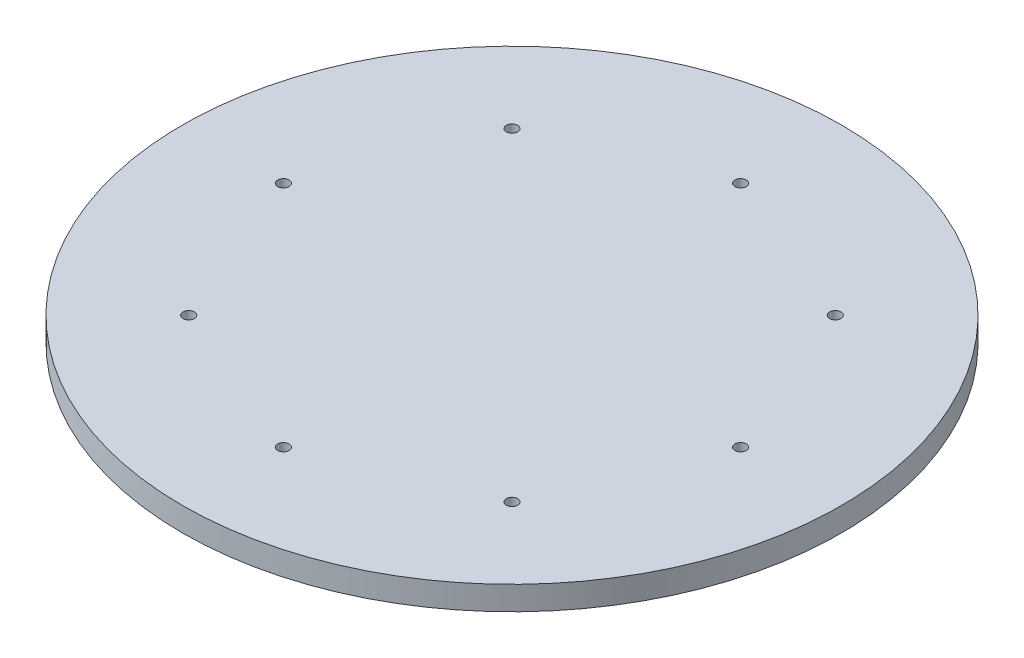
ISO-10303-21;
HEADER;
FILE_DESCRIPTION(('STEP AP214'),'2;1');
FILE_NAME('part.step','',(''),(''),'','','');
FILE_SCHEMA(('AUTOMOTIVE_DESIGN { 1 0 10303 214 1 1 1 1 }'));
ENDSEC;
DATA;
#1=APPLICATION_CONTEXT('core data for automotive mechanical design processes');
#2=APPLICATION_PROTOCOL_DEFINITION('international standard','automotive_design',2000,#1);
#3=PRODUCT_CONTEXT('',#1,'mechanical');
#4=PRODUCT('Part','Part','',(#3));
#5=PRODUCT_RELATED_PRODUCT_CATEGORY('part','',(#4));
#6=PRODUCT_DEFINITION_FORMATION('','',#4);
#7=PRODUCT_DEFINITION_CONTEXT('part definition',#1,'design');
#8=PRODUCT_DEFINITION('design','',#6,#7);
#9=PRODUCT_DEFINITION_SHAPE('','',#8);
#10=(LENGTH_UNIT() NAMED_UNIT(*) SI_UNIT(.MILLI.,.METRE.));
#11=(NAMED_UNIT(*) PLANE_ANGLE_UNIT() SI_UNIT($,.RADIAN.));
#12=(NAMED_UNIT(*) SI_UNIT($,.STERADIAN.) SOLID_ANGLE_UNIT());
#13=UNCERTAINTY_MEASURE_WITH_UNIT(LENGTH_MEASURE(1.E-05),#10,'distance_accuracy_value','');
#14=(GEOMETRIC_REPRESENTATION_CONTEXT(3) GLOBAL_UNCERTAINTY_ASSIGNED_CONTEXT((#13)) GLOBAL_UNIT_ASSIGNED_CONTEXT((#10,
#11,#12)) REPRESENTATION_CONTEXT('',''));
#15=CARTESIAN_POINT('',(0.,0.,0.));
#16=DIRECTION('',(0.,0.,1.));
#17=DIRECTION('',(1.,0.,0.));
#18=AXIS2_PLACEMENT_3D('',#15,#16,#17);
#19=CARTESIAN_POINT('',(0.,-12.5,0.));
#20=DIRECTION('',(0.,1.,0.));
#21=DIRECTION('',(0.,0.,1.));
#22=AXIS2_PLACEMENT_3D('',#19,#20,#21);
#23=PLANE('',#22);
#24=CARTESIAN_POINT('',(-169.705627484769,-12.5,-169.705627484773));
#25=DIRECTION('',(0.,1.,0.));
#26=DIRECTION('',(0.,0.,1.));
#27=AXIS2_PLACEMENT_3D('',#24,#25,#26);
#28=CIRCLE('',#27,6.00000000000001);
#29=CARTESIAN_POINT('',(-169.705627484769,-12.5,-163.705627484773));
#30=VERTEX_POINT('',#29);
#31=EDGE_CURVE('E86',#30,#30,#28,.T.);
#32=ORIENTED_EDGE('',*,*,#31,.T.);
#33=EDGE_LOOP('',(#32));
#34=FACE_BOUND('',#33,.T.);
#35=CARTESIAN_POINT('',(-240.,-12.5,-2.51386656396706E-12));
#36=DIRECTION('',(0.,1.,0.));
#37=DIRECTION('',(0.,0.,1.));
#38=AXIS2_PLACEMENT_3D('',#35,#36,#37);
#39=CIRCLE('',#38,6.);
#40=CARTESIAN_POINT('',(-240.,-12.5,5.99999999999749));
#41=VERTEX_POINT('',#40);
#42=EDGE_CURVE('E80',#41,#41,#39,.T.);
#43=ORIENTED_EDGE('',*,*,#42,.T.);
#44=EDGE_LOOP('',(#43));
#45=FACE_BOUND('',#44,.T.);
#46=CARTESIAN_POINT('',(-169.705627484773,-12.5,169.70562748477));
#47=DIRECTION('',(0.,1.,0.));
#48=DIRECTION('',(0.,0.,1.));
#49=AXIS2_PLACEMENT_3D('',#46,#47,#48);
#50=CIRCLE('',#49,6.00000000000001);
#51=CARTESIAN_POINT('',(-169.705627484773,-12.5,175.70562748477));
#52=VERTEX_POINT('',#51);
#53=EDGE_CURVE('E74',#52,#52,#50,.T.);
#54=ORIENTED_EDGE('',*,*,#53,.T.);
#55=EDGE_LOOP('',(#54));
#56=FACE_BOUND('',#55,.T.);
#57=CARTESIAN_POINT('',(-1.6759110426447E-12,-12.5,240.));
#58=DIRECTION('',(0.,1.,0.));
#59=DIRECTION('',(0.,0.,1.));
#60=AXIS2_PLACEMENT_3D('',#57,#58,#59);
#61=CIRCLE('',#60,6.00000000000001);
#62=CARTESIAN_POINT('',(-1.6759110426447E-12,-12.5,246.));
#63=VERTEX_POINT('',#62);
#64=EDGE_CURVE('E68',#63,#63,#61,.T.);
#65=ORIENTED_EDGE('',*,*,#64,.T.);
#66=EDGE_LOOP('',(#65));
#67=FACE_BOUND('',#66,.T.);
#68=CARTESIAN_POINT('',(169.70562748477,-12.5,169.705627484772));
#69=DIRECTION('',(0.,1.,0.));
#70=DIRECTION('',(0.,0.,1.));
#71=AXIS2_PLACEMENT_3D('',#68,#69,#70);
#72=CIRCLE('',#71,5.99999999999998);
#73=CARTESIAN_POINT('',(169.70562748477,-12.5,175.705627484772));
#74=VERTEX_POINT('',#73);
#75=EDGE_CURVE('E62',#74,#74,#72,.T.);
#76=ORIENTED_EDGE('',*,*,#75,.T.);
#77=EDGE_LOOP('',(#76));
#78=FACE_BOUND('',#77,.T.);
#79=CARTESIAN_POINT('',(240.,-12.5,8.37955521322352E-13));
#80=DIRECTION('',(0.,1.,0.));
#81=DIRECTION('',(0.,0.,1.));
#82=AXIS2_PLACEMENT_3D('',#79,#80,#81);
#83=CIRCLE('',#82,6.);
#84=CARTESIAN_POINT('',(240.,-12.5,6.00000000000084));
#85=VERTEX_POINT('',#84);
#86=EDGE_CURVE('E56',#85,#85,#83,.T.);
#87=ORIENTED_EDGE('',*,*,#86,.T.);
#88=EDGE_LOOP('',(#87));
#89=FACE_BOUND('',#88,.T.);
#90=CARTESIAN_POINT('',(169.705627484772,-12.5,-169.705627484771));
#91=DIRECTION('',(0.,1.,0.));
#92=DIRECTION('',(0.,0.,1.));
#93=AXIS2_PLACEMENT_3D('',#90,#91,#92);
#94=CIRCLE('',#93,5.99999999999998);
#95=CARTESIAN_POINT('',(169.705627484772,-12.5,-163.705627484771));
#96=VERTEX_POINT('',#95);
#97=EDGE_CURVE('E50',#96,#96,#94,.T.);
#98=ORIENTED_EDGE('',*,*,#97,.T.);
#99=EDGE_LOOP('',(#98));
#100=FACE_BOUND('',#99,.T.);
#101=CARTESIAN_POINT('',(0.,-12.5,-240.));
#102=DIRECTION('',(0.,1.,0.));
#103=DIRECTION('',(0.,0.,1.));
#104=AXIS2_PLACEMENT_3D('',#101,#102,#103);
#105=CIRCLE('',#104,6.);
#106=CARTESIAN_POINT('',(0.,-12.5,-234.));
#107=VERTEX_POINT('',#106);
#108=EDGE_CURVE('E44',#107,#107,#105,.T.);
#109=ORIENTED_EDGE('',*,*,#108,.T.);
#110=EDGE_LOOP('',(#109));
#111=FACE_BOUND('',#110,.T.);
#112=CARTESIAN_POINT('',(0.,-12.5,0.));
#113=DIRECTION('',(0.,-1.,0.));
#114=DIRECTION('',(0.,0.,-1.));
#115=AXIS2_PLACEMENT_3D('',#112,#113,#114);
#116=CIRCLE('',#115,286.);
#117=CARTESIAN_POINT('',(0.,-12.5,-286.));
#118=VERTEX_POINT('',#117);
#119=EDGE_CURVE('E98',#118,#118,#116,.T.);
#120=ORIENTED_EDGE('',*,*,#119,.T.);
#121=EDGE_LOOP('',(#120));
#122=FACE_BOUND('',#121,.T.);
#123=ADVANCED_FACE('F31',(#34,#45,#56,#67,#78,#89,#100,#111,#122),#23,.F.);
#124=CARTESIAN_POINT('',(0.,12.5,0.));
#125=DIRECTION('',(0.,1.,0.));
#126=DIRECTION('',(0.,0.,1.));
#127=AXIS2_PLACEMENT_3D('',#124,#125,#126);
#128=PLANE('',#127);
#129=CARTESIAN_POINT('',(-240.,12.5,-2.51386656396706E-12));
#130=DIRECTION('',(0.,1.,0.));
#131=DIRECTION('',(0.,0.,1.));
#132=AXIS2_PLACEMENT_3D('',#129,#130,#131);
#133=CIRCLE('',#132,6.);
#134=CARTESIAN_POINT('',(-240.,12.5,5.99999999999749));
#135=VERTEX_POINT('',#134);
#136=EDGE_CURVE('E77',#135,#135,#133,.T.);
#137=ORIENTED_EDGE('',*,*,#136,.F.);
#138=EDGE_LOOP('',(#137));
#139=FACE_BOUND('',#138,.T.);
#140=CARTESIAN_POINT('',(-1.6759110426447E-12,12.5,240.));
#141=DIRECTION('',(0.,1.,0.));
#142=DIRECTION('',(0.,0.,1.));
#143=AXIS2_PLACEMENT_3D('',#140,#141,#142);
#144=CIRCLE('',#143,6.00000000000001);
#145=CARTESIAN_POINT('',(-1.6759110426447E-12,12.5,246.));
#146=VERTEX_POINT('',#145);
#147=EDGE_CURVE('E65',#146,#146,#144,.T.);
#148=ORIENTED_EDGE('',*,*,#147,.F.);
#149=EDGE_LOOP('',(#148));
#150=FACE_BOUND('',#149,.T.);
#151=CARTESIAN_POINT('',(240.,12.5,8.37955521322352E-13));
#152=DIRECTION('',(0.,1.,0.));
#153=DIRECTION('',(0.,0.,1.));
#154=AXIS2_PLACEMENT_3D('',#151,#152,#153);
#155=CIRCLE('',#154,6.);
#156=CARTESIAN_POINT('',(240.,12.5,6.00000000000084));
#157=VERTEX_POINT('',#156);
#158=EDGE_CURVE('E53',#157,#157,#155,.T.);
#159=ORIENTED_EDGE('',*,*,#158,.F.);
#160=EDGE_LOOP('',(#159));
#161=FACE_BOUND('',#160,.T.);
#162=CARTESIAN_POINT('',(0.,12.5,-240.));
#163=DIRECTION('',(0.,1.,0.));
#164=DIRECTION('',(0.,0.,1.));
#165=AXIS2_PLACEMENT_3D('',#162,#163,#164);
#166=CIRCLE('',#165,6.);
#167=CARTESIAN_POINT('',(0.,12.5,-234.));
#168=VERTEX_POINT('',#167);
#169=EDGE_CURVE('E42',#168,#168,#166,.T.);
#170=ORIENTED_EDGE('',*,*,#169,.F.);
#171=EDGE_LOOP('',(#170));
#172=FACE_BOUND('',#171,.T.);
#173=CARTESIAN_POINT('',(0.,12.5,0.));
#174=DIRECTION('',(0.,1.,0.));
#175=DIRECTION('',(0.,0.,1.));
#176=AXIS2_PLACEMENT_3D('',#173,#174,#175);
#177=CIRCLE('',#176,346.);
#178=CARTESIAN_POINT('',(0.,12.5,346.));
#179=VERTEX_POINT('',#178);
#180=EDGE_CURVE('E10',#179,#179,#177,.T.);
#181=ORIENTED_EDGE('',*,*,#180,.T.);
#182=EDGE_LOOP('',(#181));
#183=FACE_BOUND('',#182,.T.);
#184=CARTESIAN_POINT('',(169.705627484772,12.5,-169.705627484771));
#185=DIRECTION('',(0.,1.,0.));
#186=DIRECTION('',(0.,0.,1.));
#187=AXIS2_PLACEMENT_3D('',#184,#185,#186);
#188=CIRCLE('',#187,5.99999999999998);
#189=CARTESIAN_POINT('',(169.705627484772,12.5,-163.705627484771));
#190=VERTEX_POINT('',#189);
#191=EDGE_CURVE('E47',#190,#190,#188,.T.);
#192=ORIENTED_EDGE('',*,*,#191,.F.);
#193=EDGE_LOOP('',(#192));
#194=FACE_BOUND('',#193,.T.);
#195=CARTESIAN_POINT('',(169.70562748477,12.5,169.705627484772));
#196=DIRECTION('',(0.,1.,0.));
#197=DIRECTION('',(0.,0.,1.));
#198=AXIS2_PLACEMENT_3D('',#195,#196,#197);
#199=CIRCLE('',#198,5.99999999999998);
#200=CARTESIAN_POINT('',(169.70562748477,12.5,175.705627484772));
#201=VERTEX_POINT('',#200);
#202=EDGE_CURVE('E59',#201,#201,#199,.T.);
#203=ORIENTED_EDGE('',*,*,#202,.F.);
#204=EDGE_LOOP('',(#203));
#205=FACE_BOUND('',#204,.T.);
#206=CARTESIAN_POINT('',(-169.705627484773,12.5,169.70562748477));
#207=DIRECTION('',(0.,1.,0.));
#208=DIRECTION('',(0.,0.,1.));
#209=AXIS2_PLACEMENT_3D('',#206,#207,#208);
#210=CIRCLE('',#209,6.00000000000001);
#211=CARTESIAN_POINT('',(-169.705627484773,12.5,175.70562748477));
#212=VERTEX_POINT('',#211);
#213=EDGE_CURVE('E71',#212,#212,#210,.T.);
#214=ORIENTED_EDGE('',*,*,#213,.F.);
#215=EDGE_LOOP('',(#214));
#216=FACE_BOUND('',#215,.T.);
#217=CARTESIAN_POINT('',(-169.705627484769,12.5,-169.705627484773));
#218=DIRECTION('',(0.,1.,0.));
#219=DIRECTION('',(0.,0.,1.));
#220=AXIS2_PLACEMENT_3D('',#217,#218,#219);
#221=CIRCLE('',#220,6.00000000000001);
#222=CARTESIAN_POINT('',(-169.705627484769,12.5,-163.705627484773));
#223=VERTEX_POINT('',#222);
#224=EDGE_CURVE('E83',#223,#223,#221,.T.);
#225=ORIENTED_EDGE('',*,*,#224,.F.);
#226=EDGE_LOOP('',(#225));
#227=FACE_BOUND('',#226,.T.);
#228=ADVANCED_FACE('F123',(#139,#150,#161,#172,#183,#194,#205,#216,#227),#128,.T.);
#229=CARTESIAN_POINT('',(0.,-12.5,0.));
#230=DIRECTION('',(0.,-1.,0.));
#231=DIRECTION('',(0.,0.,-1.));
#232=AXIS2_PLACEMENT_3D('',#229,#230,#231);
#233=CIRCLE('',#232,317.);
#234=CARTESIAN_POINT('',(0.,-12.5,-317.));
#235=VERTEX_POINT('',#234);
#236=EDGE_CURVE('E92',#235,#235,#233,.T.);
#237=ORIENTED_EDGE('',*,*,#236,.F.);
#238=EDGE_LOOP('',(#237));
#239=FACE_BOUND('',#238,.T.);
#240=CARTESIAN_POINT('',(0.,-12.5,0.));
#241=DIRECTION('',(0.,1.,0.));
#242=DIRECTION('',(0.,0.,1.));
#243=AXIS2_PLACEMENT_3D('',#240,#241,#242);
#244=CIRCLE('',#243,346.);
#245=CARTESIAN_POINT('',(0.,-12.5,346.));
#246=VERTEX_POINT('',#245);
#247=EDGE_CURVE('E35',#246,#246,#244,.T.);
#248=ORIENTED_EDGE('',*,*,#247,.F.);
#249=EDGE_LOOP('',(#248));
#250=FACE_BOUND('',#249,.T.);
#251=ADVANCED_FACE('F120',(#239,#250),#23,.F.);
#252=CARTESIAN_POINT('',(0.,12.5,0.));
#253=DIRECTION('',(0.,-1.,0.));
#254=DIRECTION('',(0.,0.,-1.));
#255=AXIS2_PLACEMENT_3D('',#252,#253,#254);
#256=CYLINDRICAL_SURFACE('',#255,346.);
#257=ORIENTED_EDGE('',*,*,#180,.F.);
#258=EDGE_LOOP('',(#257));
#259=FACE_BOUND('',#258,.T.);
#260=ORIENTED_EDGE('',*,*,#247,.T.);
#261=EDGE_LOOP('',(#260));
#262=FACE_BOUND('',#261,.T.);
#263=ADVANCED_FACE('F33',(#259,#262),#256,.T.);
#264=CARTESIAN_POINT('',(0.,12.5,-240.));
#265=DIRECTION('',(0.,-1.,0.));
#266=DIRECTION('',(0.,0.,-1.));
#267=AXIS2_PLACEMENT_3D('',#264,#265,#266);
#268=CYLINDRICAL_SURFACE('',#267,6.);
#269=ORIENTED_EDGE('',*,*,#169,.T.);
#270=EDGE_LOOP('',(#269));
#271=FACE_BOUND('',#270,.T.);
#272=ORIENTED_EDGE('',*,*,#108,.F.);
#273=EDGE_LOOP('',(#272));
#274=FACE_BOUND('',#273,.T.);
#275=ADVANCED_FACE('F127',(#271,#274),#268,.F.);
#276=CARTESIAN_POINT('',(169.705627484772,12.5,-169.705627484771));
#277=DIRECTION('',(0.,-1.,0.));
#278=DIRECTION('',(0.,0.,-1.));
#279=AXIS2_PLACEMENT_3D('',#276,#277,#278);
#280=CYLINDRICAL_SURFACE('',#279,5.99999999999998);
#281=ORIENTED_EDGE('',*,*,#191,.T.);
#282=EDGE_LOOP('',(#281));
#283=FACE_BOUND('',#282,.T.);
#284=ORIENTED_EDGE('',*,*,#97,.F.);
#285=EDGE_LOOP('',(#284));
#286=FACE_BOUND('',#285,.T.);
#287=ADVANCED_FACE('F132',(#283,#286),#280,.F.);
#288=CARTESIAN_POINT('',(240.,12.5,8.37955521322352E-13));
#289=DIRECTION('',(0.,-1.,0.));
#290=DIRECTION('',(0.,0.,-1.));
#291=AXIS2_PLACEMENT_3D('',#288,#289,#290);
#292=CYLINDRICAL_SURFACE('',#291,6.);
#293=ORIENTED_EDGE('',*,*,#158,.T.);
#294=EDGE_LOOP('',(#293));
#295=FACE_BOUND('',#294,.T.);
#296=ORIENTED_EDGE('',*,*,#86,.F.);
#297=EDGE_LOOP('',(#296));
#298=FACE_BOUND('',#297,.T.);
#299=ADVANCED_FACE('F146',(#295,#298),#292,.F.);
#300=CARTESIAN_POINT('',(169.70562748477,12.5,169.705627484772));
#301=DIRECTION('',(0.,-1.,0.));
#302=DIRECTION('',(0.,0.,-1.));
#303=AXIS2_PLACEMENT_3D('',#300,#301,#302);
#304=CYLINDRICAL_SURFACE('',#303,5.99999999999998);
#305=ORIENTED_EDGE('',*,*,#202,.T.);
#306=EDGE_LOOP('',(#305));
#307=FACE_BOUND('',#306,.T.);
#308=ORIENTED_EDGE('',*,*,#75,.F.);
#309=EDGE_LOOP('',(#308));
#310=FACE_BOUND('',#309,.T.);
#311=ADVANCED_FACE('F150',(#307,#310),#304,.F.);
#312=CARTESIAN_POINT('',(-1.6759110426447E-12,12.5,240.));
#313=DIRECTION('',(0.,-1.,0.));
#314=DIRECTION('',(0.,0.,-1.));
#315=AXIS2_PLACEMENT_3D('',#312,#313,#314);
#316=CYLINDRICAL_SURFACE('',#315,6.00000000000001);
#317=ORIENTED_EDGE('',*,*,#147,.T.);
#318=EDGE_LOOP('',(#317));
#319=FACE_BOUND('',#318,.T.);
#320=ORIENTED_EDGE('',*,*,#64,.F.);
#321=EDGE_LOOP('',(#320));
#322=FACE_BOUND('',#321,.T.);
#323=ADVANCED_FACE('F154',(#319,#322),#316,.F.);
#324=CARTESIAN_POINT('',(-169.705627484773,12.5,169.70562748477));
#325=DIRECTION('',(0.,-1.,0.));
#326=DIRECTION('',(0.,0.,-1.));
#327=AXIS2_PLACEMENT_3D('',#324,#325,#326);
#328=CYLINDRICAL_SURFACE('',#327,6.00000000000001);
#329=ORIENTED_EDGE('',*,*,#213,.T.);
#330=EDGE_LOOP('',(#329));
#331=FACE_BOUND('',#330,.T.);
#332=ORIENTED_EDGE('',*,*,#53,.F.);
#333=EDGE_LOOP('',(#332));
#334=FACE_BOUND('',#333,.T.);
#335=ADVANCED_FACE('F158',(#331,#334),#328,.F.);
#336=CARTESIAN_POINT('',(-240.,12.5,-2.51386656396706E-12));
#337=DIRECTION('',(0.,-1.,0.));
#338=DIRECTION('',(0.,0.,-1.));
#339=AXIS2_PLACEMENT_3D('',#336,#337,#338);
#340=CYLINDRICAL_SURFACE('',#339,6.);
#341=ORIENTED_EDGE('',*,*,#136,.T.);
#342=EDGE_LOOP('',(#341));
#343=FACE_BOUND('',#342,.T.);
#344=ORIENTED_EDGE('',*,*,#42,.F.);
#345=EDGE_LOOP('',(#344));
#346=FACE_BOUND('',#345,.T.);
#347=ADVANCED_FACE('F162',(#343,#346),#340,.F.);
#348=CARTESIAN_POINT('',(-169.705627484769,12.5,-169.705627484773));
#349=DIRECTION('',(0.,-1.,0.));
#350=DIRECTION('',(0.,0.,-1.));
#351=AXIS2_PLACEMENT_3D('',#348,#349,#350);
#352=CYLINDRICAL_SURFACE('',#351,6.00000000000001);
#353=ORIENTED_EDGE('',*,*,#224,.T.);
#354=EDGE_LOOP('',(#353));
#355=FACE_BOUND('',#354,.T.);
#356=ORIENTED_EDGE('',*,*,#31,.F.);
#357=EDGE_LOOP('',(#356));
#358=FACE_BOUND('',#357,.T.);
#359=ADVANCED_FACE('F116',(#355,#358),#352,.F.);
#360=CARTESIAN_POINT('',(0.,-0.5,0.));
#361=DIRECTION('',(0.,-1.,0.));
#362=DIRECTION('',(0.,0.,-1.));
#363=AXIS2_PLACEMENT_3D('',#360,#361,#362);
#364=CYLINDRICAL_SURFACE('',#363,317.);
#365=CARTESIAN_POINT('',(0.,-0.5,0.));
#366=DIRECTION('',(0.,-1.,0.));
#367=DIRECTION('',(0.,0.,-1.));
#368=AXIS2_PLACEMENT_3D('',#365,#366,#367);
#369=CIRCLE('',#368,317.);
#370=CARTESIAN_POINT('',(0.,-0.5,-317.));
#371=VERTEX_POINT('',#370);
#372=EDGE_CURVE('E89',#371,#371,#369,.T.);
#373=ORIENTED_EDGE('',*,*,#372,.F.);
#374=EDGE_LOOP('',(#373));
#375=FACE_BOUND('',#374,.T.);
#376=ORIENTED_EDGE('',*,*,#236,.T.);
#377=EDGE_LOOP('',(#376));
#378=FACE_BOUND('',#377,.T.);
#379=ADVANCED_FACE('F110',(#375,#378),#364,.F.);
#380=CARTESIAN_POINT('',(0.,-0.5,0.));
#381=DIRECTION('',(0.,-1.,0.));
#382=DIRECTION('',(0.,0.,-1.));
#383=AXIS2_PLACEMENT_3D('',#380,#381,#382);
#384=PLANE('',#383);
#385=CARTESIAN_POINT('',(0.,-0.5,0.));
#386=DIRECTION('',(0.,-1.,0.));
#387=DIRECTION('',(0.,0.,-1.));
#388=AXIS2_PLACEMENT_3D('',#385,#386,#387);
#389=CIRCLE('',#388,286.);
#390=CARTESIAN_POINT('',(0.,-0.5,-286.));
#391=VERTEX_POINT('',#390);
#392=EDGE_CURVE('E95',#391,#391,#389,.T.);
#393=ORIENTED_EDGE('',*,*,#392,.F.);
#394=EDGE_LOOP('',(#393));
#395=FACE_BOUND('',#394,.T.);
#396=ORIENTED_EDGE('',*,*,#372,.T.);
#397=EDGE_LOOP('',(#396));
#398=FACE_BOUND('',#397,.T.);
#399=ADVANCED_FACE('F107',(#395,#398),#384,.T.);
#400=CARTESIAN_POINT('',(0.,-0.5,0.));
#401=DIRECTION('',(0.,-1.,0.));
#402=DIRECTION('',(0.,0.,-1.));
#403=AXIS2_PLACEMENT_3D('',#400,#401,#402);
#404=CYLINDRICAL_SURFACE('',#403,286.);
#405=ORIENTED_EDGE('',*,*,#392,.T.);
#406=EDGE_LOOP('',(#405));
#407=FACE_BOUND('',#406,.T.);
#408=ORIENTED_EDGE('',*,*,#119,.F.);
#409=EDGE_LOOP('',(#408));
#410=FACE_BOUND('',#409,.T.);
#411=ADVANCED_FACE('F104',(#407,#410),#404,.T.);
#412=CLOSED_SHELL('',(#123,#228,#251,#263,#275,#287,#299,#311,#323,#335,#347,#359,#379,#399,#411));
#413=MANIFOLD_SOLID_BREP('B2',#412);
#414=ADVANCED_BREP_SHAPE_REPRESENTATION('',(#18,#413),#14);
#415=SHAPE_DEFINITION_REPRESENTATION(#9,#414);
ENDSEC;
END-ISO-10303-21;
